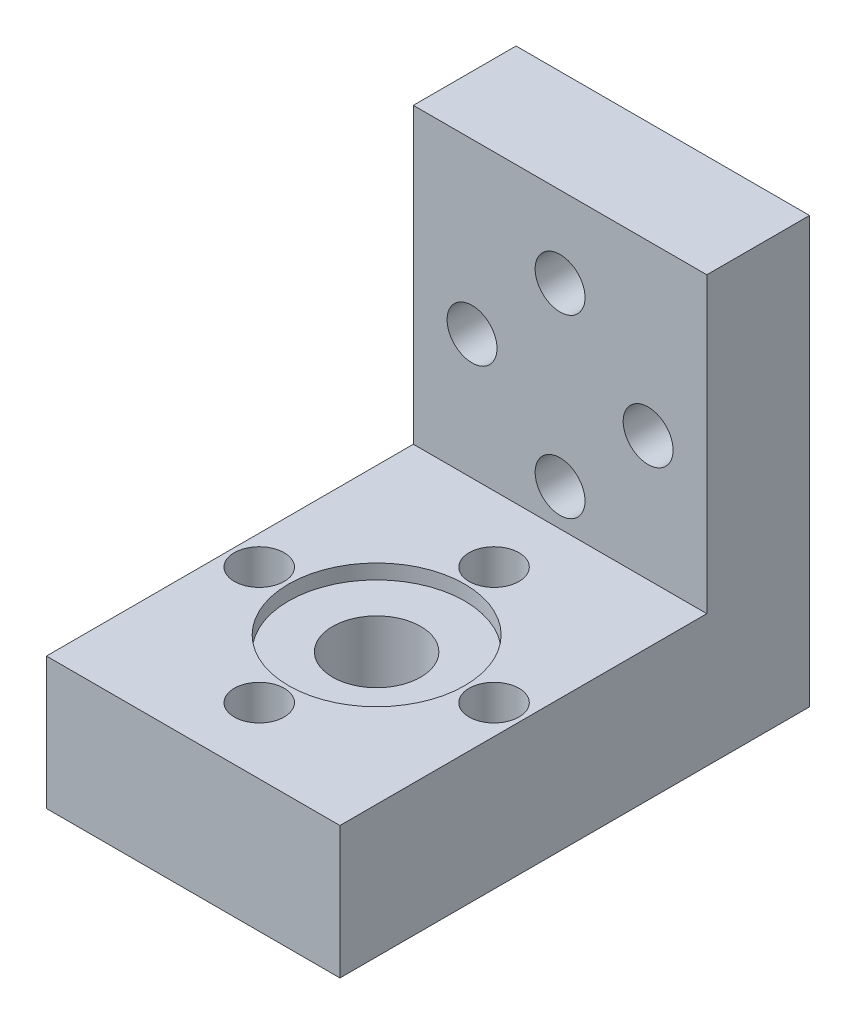
ISO-10303-21;
HEADER;
FILE_DESCRIPTION(('STEP AP214'),'2;1');
FILE_NAME('part.step','',(''),(''),'','','');
FILE_SCHEMA(('AUTOMOTIVE_DESIGN { 1 0 10303 214 1 1 1 1 }'));
ENDSEC;
DATA;
#1=APPLICATION_CONTEXT('core data for automotive mechanical design processes');
#2=APPLICATION_PROTOCOL_DEFINITION('international standard','automotive_design',2000,#1);
#3=PRODUCT_CONTEXT('',#1,'mechanical');
#4=PRODUCT('Part','Part','',(#3));
#5=PRODUCT_RELATED_PRODUCT_CATEGORY('part','',(#4));
#6=PRODUCT_DEFINITION_FORMATION('','',#4);
#7=PRODUCT_DEFINITION_CONTEXT('part definition',#1,'design');
#8=PRODUCT_DEFINITION('design','',#6,#7);
#9=PRODUCT_DEFINITION_SHAPE('','',#8);
#10=(LENGTH_UNIT() NAMED_UNIT(*) SI_UNIT(.MILLI.,.METRE.));
#11=(NAMED_UNIT(*) PLANE_ANGLE_UNIT() SI_UNIT($,.RADIAN.));
#12=(NAMED_UNIT(*) SI_UNIT($,.STERADIAN.) SOLID_ANGLE_UNIT());
#13=UNCERTAINTY_MEASURE_WITH_UNIT(LENGTH_MEASURE(1.E-05),#10,'distance_accuracy_value','');
#14=(GEOMETRIC_REPRESENTATION_CONTEXT(3) GLOBAL_UNCERTAINTY_ASSIGNED_CONTEXT((#13)) GLOBAL_UNIT_ASSIGNED_CONTEXT((#10,
#11,#12)) REPRESENTATION_CONTEXT('',''));
#15=CARTESIAN_POINT('',(0.,0.,0.));
#16=DIRECTION('',(0.,0.,1.));
#17=DIRECTION('',(1.,0.,0.));
#18=AXIS2_PLACEMENT_3D('',#15,#16,#17);
#19=CARTESIAN_POINT('',(40.,58.,-14.));
#20=DIRECTION('',(0.,0.,1.));
#21=DIRECTION('',(1.,0.,0.));
#22=AXIS2_PLACEMENT_3D('',#19,#20,#21);
#23=PLANE('',#22);
#24=CARTESIAN_POINT('',(20.,47.,-14.));
#25=DIRECTION('',(0.,0.,1.));
#26=DIRECTION('',(1.,0.,0.));
#27=AXIS2_PLACEMENT_3D('',#24,#25,#26);
#28=CIRCLE('',#27,3.4);
#29=CARTESIAN_POINT('',(23.4,47.,-14.));
#30=VERTEX_POINT('',#29);
#31=EDGE_CURVE('E197',#30,#30,#28,.T.);
#32=ORIENTED_EDGE('',*,*,#31,.T.);
#33=EDGE_LOOP('',(#32));
#34=FACE_BOUND('',#33,.T.);
#35=CARTESIAN_POINT('',(32.,35.,-14.));
#36=DIRECTION('',(0.,0.,1.));
#37=DIRECTION('',(1.,0.,0.));
#38=AXIS2_PLACEMENT_3D('',#35,#36,#37);
#39=CIRCLE('',#38,3.4);
#40=CARTESIAN_POINT('',(35.4,35.,-14.));
#41=VERTEX_POINT('',#40);
#42=EDGE_CURVE('E240',#41,#41,#39,.T.);
#43=ORIENTED_EDGE('',*,*,#42,.T.);
#44=EDGE_LOOP('',(#43));
#45=FACE_BOUND('',#44,.T.);
#46=CARTESIAN_POINT('',(20.,23.,-14.));
#47=DIRECTION('',(0.,0.,1.));
#48=DIRECTION('',(1.,0.,0.));
#49=AXIS2_PLACEMENT_3D('',#46,#47,#48);
#50=CIRCLE('',#49,3.4);
#51=CARTESIAN_POINT('',(23.4,23.,-14.));
#52=VERTEX_POINT('',#51);
#53=EDGE_CURVE('E232',#52,#52,#50,.T.);
#54=ORIENTED_EDGE('',*,*,#53,.T.);
#55=EDGE_LOOP('',(#54));
#56=FACE_BOUND('',#55,.T.);
#57=CARTESIAN_POINT('',(8.,35.,-14.));
#58=DIRECTION('',(0.,0.,1.));
#59=DIRECTION('',(1.,0.,0.));
#60=AXIS2_PLACEMENT_3D('',#57,#58,#59);
#61=CIRCLE('',#60,3.4);
#62=CARTESIAN_POINT('',(11.4,35.,-14.));
#63=VERTEX_POINT('',#62);
#64=EDGE_CURVE('E224',#63,#63,#61,.T.);
#65=ORIENTED_EDGE('',*,*,#64,.T.);
#66=EDGE_LOOP('',(#65));
#67=FACE_BOUND('',#66,.T.);
#68=DIRECTION('',(0.,1.,0.));
#69=VECTOR('',#68,1.);
#70=CARTESIAN_POINT('',(0.,58.,-14.));
#71=LINE('',#70,#69);
#72=CARTESIAN_POINT('',(0.,0.,-14.));
#73=VERTEX_POINT('',#72);
#74=CARTESIAN_POINT('',(0.,58.,-14.));
#75=VERTEX_POINT('',#74);
#76=EDGE_CURVE('E138',#73,#75,#71,.T.);
#77=ORIENTED_EDGE('',*,*,#76,.T.);
#78=DIRECTION('',(-1.,0.,0.));
#79=VECTOR('',#78,1.);
#80=CARTESIAN_POINT('',(40.,58.,-14.));
#81=LINE('',#80,#79);
#82=CARTESIAN_POINT('',(40.,58.,-14.));
#83=VERTEX_POINT('',#82);
#84=EDGE_CURVE('E54',#83,#75,#81,.T.);
#85=ORIENTED_EDGE('',*,*,#84,.F.);
#86=DIRECTION('',(0.,1.,0.));
#87=VECTOR('',#86,1.);
#88=CARTESIAN_POINT('',(40.,58.,-14.));
#89=LINE('',#88,#87);
#90=CARTESIAN_POINT('',(40.,0.,-14.));
#91=VERTEX_POINT('',#90);
#92=EDGE_CURVE('E100',#91,#83,#89,.T.);
#93=ORIENTED_EDGE('',*,*,#92,.F.);
#94=DIRECTION('',(-1.,0.,0.));
#95=VECTOR('',#94,1.);
#96=CARTESIAN_POINT('',(40.,0.,-14.));
#97=LINE('',#96,#95);
#98=EDGE_CURVE('E11',#91,#73,#97,.T.);
#99=ORIENTED_EDGE('',*,*,#98,.T.);
#100=EDGE_LOOP('',(#77,#85,#93,#99));
#101=FACE_BOUND('',#100,.T.);
#102=ADVANCED_FACE('F45',(#34,#45,#56,#67,#101),#23,.F.);
#103=CARTESIAN_POINT('',(40.,58.,0.));
#104=DIRECTION('',(0.,-1.,0.));
#105=DIRECTION('',(0.,0.,-1.));
#106=AXIS2_PLACEMENT_3D('',#103,#104,#105);
#107=PLANE('',#106);
#108=DIRECTION('',(0.,0.,1.));
#109=VECTOR('',#108,1.);
#110=CARTESIAN_POINT('',(0.,58.,0.));
#111=LINE('',#110,#109);
#112=CARTESIAN_POINT('',(0.,58.,0.));
#113=VERTEX_POINT('',#112);
#114=EDGE_CURVE('E141',#75,#113,#111,.T.);
#115=ORIENTED_EDGE('',*,*,#114,.T.);
#116=DIRECTION('',(-1.,0.,0.));
#117=VECTOR('',#116,1.);
#118=CARTESIAN_POINT('',(40.,58.,0.));
#119=LINE('',#118,#117);
#120=CARTESIAN_POINT('',(40.,58.,0.));
#121=VERTEX_POINT('',#120);
#122=EDGE_CURVE('E125',#121,#113,#119,.T.);
#123=ORIENTED_EDGE('',*,*,#122,.F.);
#124=DIRECTION('',(0.,0.,1.));
#125=VECTOR('',#124,1.);
#126=CARTESIAN_POINT('',(40.,58.,0.));
#127=LINE('',#126,#125);
#128=EDGE_CURVE('E114',#83,#121,#127,.T.);
#129=ORIENTED_EDGE('',*,*,#128,.F.);
#130=ORIENTED_EDGE('',*,*,#84,.T.);
#131=EDGE_LOOP('',(#115,#123,#129,#130));
#132=FACE_BOUND('',#131,.T.);
#133=ADVANCED_FACE('F163',(#132),#107,.F.);
#134=CARTESIAN_POINT('',(40.,18.,0.));
#135=DIRECTION('',(0.,0.,-1.));
#136=DIRECTION('',(0.,1.,0.));
#137=AXIS2_PLACEMENT_3D('',#134,#135,#136);
#138=PLANE('',#137);
#139=CARTESIAN_POINT('',(20.,47.,0.));
#140=DIRECTION('',(0.,0.,1.));
#141=DIRECTION('',(1.,0.,0.));
#142=AXIS2_PLACEMENT_3D('',#139,#140,#141);
#143=CIRCLE('',#142,3.4);
#144=CARTESIAN_POINT('',(23.4,47.,0.));
#145=VERTEX_POINT('',#144);
#146=EDGE_CURVE('E248',#145,#145,#143,.T.);
#147=ORIENTED_EDGE('',*,*,#146,.F.);
#148=EDGE_LOOP('',(#147));
#149=FACE_BOUND('',#148,.T.);
#150=CARTESIAN_POINT('',(32.,35.,0.));
#151=DIRECTION('',(0.,0.,1.));
#152=DIRECTION('',(1.,0.,0.));
#153=AXIS2_PLACEMENT_3D('',#150,#151,#152);
#154=CIRCLE('',#153,3.4);
#155=CARTESIAN_POINT('',(35.4,35.,0.));
#156=VERTEX_POINT('',#155);
#157=EDGE_CURVE('E244',#156,#156,#154,.T.);
#158=ORIENTED_EDGE('',*,*,#157,.F.);
#159=EDGE_LOOP('',(#158));
#160=FACE_BOUND('',#159,.T.);
#161=CARTESIAN_POINT('',(20.,23.,0.));
#162=DIRECTION('',(0.,0.,1.));
#163=DIRECTION('',(1.,0.,0.));
#164=AXIS2_PLACEMENT_3D('',#161,#162,#163);
#165=CIRCLE('',#164,3.4);
#166=CARTESIAN_POINT('',(23.4,23.,0.));
#167=VERTEX_POINT('',#166);
#168=EDGE_CURVE('E236',#167,#167,#165,.T.);
#169=ORIENTED_EDGE('',*,*,#168,.F.);
#170=EDGE_LOOP('',(#169));
#171=FACE_BOUND('',#170,.T.);
#172=CARTESIAN_POINT('',(8.,35.,0.));
#173=DIRECTION('',(0.,0.,1.));
#174=DIRECTION('',(1.,0.,0.));
#175=AXIS2_PLACEMENT_3D('',#172,#173,#174);
#176=CIRCLE('',#175,3.4);
#177=CARTESIAN_POINT('',(11.4,35.,0.));
#178=VERTEX_POINT('',#177);
#179=EDGE_CURVE('E228',#178,#178,#176,.T.);
#180=ORIENTED_EDGE('',*,*,#179,.F.);
#181=EDGE_LOOP('',(#180));
#182=FACE_BOUND('',#181,.T.);
#183=DIRECTION('',(0.,-1.,0.));
#184=VECTOR('',#183,1.);
#185=CARTESIAN_POINT('',(0.,18.,0.));
#186=LINE('',#185,#184);
#187=CARTESIAN_POINT('',(0.,18.,0.));
#188=VERTEX_POINT('',#187);
#189=EDGE_CURVE('E123',#113,#188,#186,.T.);
#190=ORIENTED_EDGE('',*,*,#189,.T.);
#191=DIRECTION('',(-1.,0.,0.));
#192=VECTOR('',#191,1.);
#193=CARTESIAN_POINT('',(40.,18.,0.));
#194=LINE('',#193,#192);
#195=CARTESIAN_POINT('',(40.,18.,0.));
#196=VERTEX_POINT('',#195);
#197=EDGE_CURVE('E120',#196,#188,#194,.T.);
#198=ORIENTED_EDGE('',*,*,#197,.F.);
#199=DIRECTION('',(0.,-1.,0.));
#200=VECTOR('',#199,1.);
#201=CARTESIAN_POINT('',(40.,18.,0.));
#202=LINE('',#201,#200);
#203=EDGE_CURVE('E108',#121,#196,#202,.T.);
#204=ORIENTED_EDGE('',*,*,#203,.F.);
#205=ORIENTED_EDGE('',*,*,#122,.T.);
#206=EDGE_LOOP('',(#190,#198,#204,#205));
#207=FACE_BOUND('',#206,.T.);
#208=ADVANCED_FACE('F121',(#149,#160,#171,#182,#207),#138,.F.);
#209=CARTESIAN_POINT('',(40.,18.,50.));
#210=DIRECTION('',(0.,-1.,0.));
#211=DIRECTION('',(0.,0.,-1.));
#212=AXIS2_PLACEMENT_3D('',#209,#210,#211);
#213=PLANE('',#212);
#214=CARTESIAN_POINT('',(20.,18.,9.));
#215=DIRECTION('',(0.,1.,0.));
#216=DIRECTION('',(0.,0.,1.));
#217=AXIS2_PLACEMENT_3D('',#214,#215,#216);
#218=CIRCLE('',#217,3.40000000000035);
#219=CARTESIAN_POINT('',(20.,18.,12.4000000000004));
#220=VERTEX_POINT('',#219);
#221=EDGE_CURVE('E217',#220,#220,#218,.T.);
#222=ORIENTED_EDGE('',*,*,#221,.F.);
#223=EDGE_LOOP('',(#222));
#224=FACE_BOUND('',#223,.T.);
#225=CARTESIAN_POINT('',(36.0000000000002,18.,24.9999999999998));
#226=DIRECTION('',(0.,1.,0.));
#227=DIRECTION('',(0.,0.,1.));
#228=AXIS2_PLACEMENT_3D('',#225,#226,#227);
#229=CIRCLE('',#228,3.40000000000035);
#230=CARTESIAN_POINT('',(36.0000000000002,18.,28.4000000000002));
#231=VERTEX_POINT('',#230);
#232=EDGE_CURVE('E213',#231,#231,#229,.T.);
#233=ORIENTED_EDGE('',*,*,#232,.F.);
#234=EDGE_LOOP('',(#233));
#235=FACE_BOUND('',#234,.T.);
#236=CARTESIAN_POINT('',(20.0000000000003,18.,41.));
#237=DIRECTION('',(0.,1.,0.));
#238=DIRECTION('',(0.,0.,1.));
#239=AXIS2_PLACEMENT_3D('',#236,#237,#238);
#240=CIRCLE('',#239,3.40000000000035);
#241=CARTESIAN_POINT('',(20.0000000000003,18.,44.4000000000003));
#242=VERTEX_POINT('',#241);
#243=EDGE_CURVE('E205',#242,#242,#240,.T.);
#244=ORIENTED_EDGE('',*,*,#243,.F.);
#245=EDGE_LOOP('',(#244));
#246=FACE_BOUND('',#245,.T.);
#247=CARTESIAN_POINT('',(4.00000000000022,18.,25.0000000000001));
#248=DIRECTION('',(0.,1.,0.));
#249=DIRECTION('',(0.,0.,1.));
#250=AXIS2_PLACEMENT_3D('',#247,#248,#249);
#251=CIRCLE('',#250,3.40000000000035);
#252=CARTESIAN_POINT('',(4.00000000000022,18.,28.4000000000004));
#253=VERTEX_POINT('',#252);
#254=EDGE_CURVE('E196',#253,#253,#251,.T.);
#255=ORIENTED_EDGE('',*,*,#254,.F.);
#256=EDGE_LOOP('',(#255));
#257=FACE_BOUND('',#256,.T.);
#258=CARTESIAN_POINT('',(20.,18.,25.));
#259=DIRECTION('',(0.,1.,0.));
#260=DIRECTION('',(0.,0.,1.));
#261=AXIS2_PLACEMENT_3D('',#258,#259,#260);
#262=CIRCLE('',#261,12.);
#263=CARTESIAN_POINT('',(20.,18.,37.));
#264=VERTEX_POINT('',#263);
#265=EDGE_CURVE('E175',#264,#264,#262,.T.);
#266=ORIENTED_EDGE('',*,*,#265,.F.);
#267=EDGE_LOOP('',(#266));
#268=FACE_BOUND('',#267,.T.);
#269=DIRECTION('',(0.,0.,1.));
#270=VECTOR('',#269,1.);
#271=CARTESIAN_POINT('',(0.,18.,50.));
#272=LINE('',#271,#270);
#273=CARTESIAN_POINT('',(0.,18.,50.));
#274=VERTEX_POINT('',#273);
#275=EDGE_CURVE('E86',#188,#274,#272,.T.);
#276=ORIENTED_EDGE('',*,*,#275,.T.);
#277=DIRECTION('',(-1.,0.,0.));
#278=VECTOR('',#277,1.);
#279=CARTESIAN_POINT('',(40.,18.,50.));
#280=LINE('',#279,#278);
#281=CARTESIAN_POINT('',(40.,18.,50.));
#282=VERTEX_POINT('',#281);
#283=EDGE_CURVE('E126',#282,#274,#280,.T.);
#284=ORIENTED_EDGE('',*,*,#283,.F.);
#285=DIRECTION('',(0.,0.,1.));
#286=VECTOR('',#285,1.);
#287=CARTESIAN_POINT('',(40.,18.,50.));
#288=LINE('',#287,#286);
#289=EDGE_CURVE('E112',#196,#282,#288,.T.);
#290=ORIENTED_EDGE('',*,*,#289,.F.);
#291=ORIENTED_EDGE('',*,*,#197,.T.);
#292=EDGE_LOOP('',(#276,#284,#290,#291));
#293=FACE_BOUND('',#292,.T.);
#294=ADVANCED_FACE('F128',(#224,#235,#246,#257,#268,#293),#213,.F.);
#295=CARTESIAN_POINT('',(40.,0.,50.));
#296=DIRECTION('',(0.,0.,-1.));
#297=DIRECTION('',(-1.,0.,0.));
#298=AXIS2_PLACEMENT_3D('',#295,#296,#297);
#299=PLANE('',#298);
#300=DIRECTION('',(0.,-1.,0.));
#301=VECTOR('',#300,1.);
#302=CARTESIAN_POINT('',(0.,0.,50.));
#303=LINE('',#302,#301);
#304=CARTESIAN_POINT('',(0.,0.,50.));
#305=VERTEX_POINT('',#304);
#306=EDGE_CURVE('E93',#274,#305,#303,.T.);
#307=ORIENTED_EDGE('',*,*,#306,.T.);
#308=DIRECTION('',(-1.,0.,0.));
#309=VECTOR('',#308,1.);
#310=CARTESIAN_POINT('',(40.,0.,50.));
#311=LINE('',#310,#309);
#312=CARTESIAN_POINT('',(40.,0.,50.));
#313=VERTEX_POINT('',#312);
#314=EDGE_CURVE('E134',#313,#305,#311,.T.);
#315=ORIENTED_EDGE('',*,*,#314,.F.);
#316=DIRECTION('',(0.,-1.,0.));
#317=VECTOR('',#316,1.);
#318=CARTESIAN_POINT('',(40.,0.,50.));
#319=LINE('',#318,#317);
#320=EDGE_CURVE('E131',#282,#313,#319,.T.);
#321=ORIENTED_EDGE('',*,*,#320,.F.);
#322=ORIENTED_EDGE('',*,*,#283,.T.);
#323=EDGE_LOOP('',(#307,#315,#321,#322));
#324=FACE_BOUND('',#323,.T.);
#325=ADVANCED_FACE('F169',(#324),#299,.F.);
#326=CARTESIAN_POINT('',(40.,0.,0.));
#327=DIRECTION('',(0.,1.,0.));
#328=DIRECTION('',(0.,0.,1.));
#329=AXIS2_PLACEMENT_3D('',#326,#327,#328);
#330=PLANE('',#329);
#331=CARTESIAN_POINT('',(20.,0.,9.));
#332=DIRECTION('',(0.,1.,0.));
#333=DIRECTION('',(0.,0.,1.));
#334=AXIS2_PLACEMENT_3D('',#331,#332,#333);
#335=CIRCLE('',#334,3.40000000000035);
#336=CARTESIAN_POINT('',(20.,0.,12.4000000000004));
#337=VERTEX_POINT('',#336);
#338=EDGE_CURVE('E188',#337,#337,#335,.T.);
#339=ORIENTED_EDGE('',*,*,#338,.T.);
#340=EDGE_LOOP('',(#339));
#341=FACE_BOUND('',#340,.T.);
#342=CARTESIAN_POINT('',(36.0000000000002,0.,24.9999999999998));
#343=DIRECTION('',(0.,1.,0.));
#344=DIRECTION('',(0.,0.,1.));
#345=AXIS2_PLACEMENT_3D('',#342,#343,#344);
#346=CIRCLE('',#345,3.40000000000035);
#347=CARTESIAN_POINT('',(36.0000000000002,0.,28.4000000000002));
#348=VERTEX_POINT('',#347);
#349=EDGE_CURVE('E209',#348,#348,#346,.T.);
#350=ORIENTED_EDGE('',*,*,#349,.T.);
#351=EDGE_LOOP('',(#350));
#352=FACE_BOUND('',#351,.T.);
#353=CARTESIAN_POINT('',(20.0000000000003,0.,41.));
#354=DIRECTION('',(0.,1.,0.));
#355=DIRECTION('',(0.,0.,1.));
#356=AXIS2_PLACEMENT_3D('',#353,#354,#355);
#357=CIRCLE('',#356,3.40000000000035);
#358=CARTESIAN_POINT('',(20.0000000000003,0.,44.4000000000003));
#359=VERTEX_POINT('',#358);
#360=EDGE_CURVE('E201',#359,#359,#357,.T.);
#361=ORIENTED_EDGE('',*,*,#360,.T.);
#362=EDGE_LOOP('',(#361));
#363=FACE_BOUND('',#362,.T.);
#364=CARTESIAN_POINT('',(4.00000000000022,0.,25.0000000000001));
#365=DIRECTION('',(0.,1.,0.));
#366=DIRECTION('',(0.,0.,1.));
#367=AXIS2_PLACEMENT_3D('',#364,#365,#366);
#368=CIRCLE('',#367,3.40000000000035);
#369=CARTESIAN_POINT('',(4.00000000000022,0.,28.4000000000004));
#370=VERTEX_POINT('',#369);
#371=EDGE_CURVE('E192',#370,#370,#368,.T.);
#372=ORIENTED_EDGE('',*,*,#371,.T.);
#373=EDGE_LOOP('',(#372));
#374=FACE_BOUND('',#373,.T.);
#375=CARTESIAN_POINT('',(20.,0.,25.));
#376=DIRECTION('',(0.,1.,0.));
#377=DIRECTION('',(0.,0.,1.));
#378=AXIS2_PLACEMENT_3D('',#375,#376,#377);
#379=CIRCLE('',#378,6.);
#380=CARTESIAN_POINT('',(20.,0.,31.));
#381=VERTEX_POINT('',#380);
#382=EDGE_CURVE('E180',#381,#381,#379,.T.);
#383=ORIENTED_EDGE('',*,*,#382,.T.);
#384=EDGE_LOOP('',(#383));
#385=FACE_BOUND('',#384,.T.);
#386=DIRECTION('',(0.,0.,-1.));
#387=VECTOR('',#386,1.);
#388=CARTESIAN_POINT('',(0.,0.,0.));
#389=LINE('',#388,#387);
#390=EDGE_CURVE('E151',#305,#73,#389,.T.);
#391=ORIENTED_EDGE('',*,*,#390,.T.);
#392=ORIENTED_EDGE('',*,*,#98,.F.);
#393=DIRECTION('',(0.,0.,-1.));
#394=VECTOR('',#393,1.);
#395=CARTESIAN_POINT('',(40.,0.,-14.));
#396=LINE('',#395,#394);
#397=EDGE_CURVE('E62',#313,#91,#396,.T.);
#398=ORIENTED_EDGE('',*,*,#397,.F.);
#399=ORIENTED_EDGE('',*,*,#314,.T.);
#400=EDGE_LOOP('',(#391,#392,#398,#399));
#401=FACE_BOUND('',#400,.T.);
#402=ADVANCED_FACE('F168',(#341,#352,#363,#374,#385,#401),#330,.F.);
#403=CARTESIAN_POINT('',(40.,0.,0.));
#404=DIRECTION('',(-1.,0.,0.));
#405=DIRECTION('',(0.,0.,1.));
#406=AXIS2_PLACEMENT_3D('',#403,#404,#405);
#407=PLANE('',#406);
#408=ORIENTED_EDGE('',*,*,#397,.T.);
#409=ORIENTED_EDGE('',*,*,#92,.T.);
#410=ORIENTED_EDGE('',*,*,#128,.T.);
#411=ORIENTED_EDGE('',*,*,#203,.T.);
#412=ORIENTED_EDGE('',*,*,#289,.T.);
#413=ORIENTED_EDGE('',*,*,#320,.T.);
#414=EDGE_LOOP('',(#408,#409,#410,#411,#412,#413));
#415=FACE_BOUND('',#414,.T.);
#416=ADVANCED_FACE('F110',(#415),#407,.F.);
#417=CARTESIAN_POINT('',(0.,0.,0.));
#418=DIRECTION('',(-1.,0.,0.));
#419=DIRECTION('',(0.,0.,1.));
#420=AXIS2_PLACEMENT_3D('',#417,#418,#419);
#421=PLANE('',#420);
#422=ORIENTED_EDGE('',*,*,#76,.F.);
#423=ORIENTED_EDGE('',*,*,#390,.F.);
#424=ORIENTED_EDGE('',*,*,#306,.F.);
#425=ORIENTED_EDGE('',*,*,#275,.F.);
#426=ORIENTED_EDGE('',*,*,#189,.F.);
#427=ORIENTED_EDGE('',*,*,#114,.F.);
#428=EDGE_LOOP('',(#422,#423,#424,#425,#426,#427));
#429=FACE_BOUND('',#428,.T.);
#430=ADVANCED_FACE('F166',(#429),#421,.T.);
#431=CARTESIAN_POINT('',(20.,16.,25.));
#432=DIRECTION('',(0.,1.,0.));
#433=DIRECTION('',(0.,0.,1.));
#434=AXIS2_PLACEMENT_3D('',#431,#432,#433);
#435=CYLINDRICAL_SURFACE('',#434,12.);
#436=CARTESIAN_POINT('',(20.,16.,25.));
#437=DIRECTION('',(0.,1.,0.));
#438=DIRECTION('',(0.,0.,1.));
#439=AXIS2_PLACEMENT_3D('',#436,#437,#438);
#440=CIRCLE('',#439,12.);
#441=CARTESIAN_POINT('',(20.,16.,37.));
#442=VERTEX_POINT('',#441);
#443=EDGE_CURVE('E142',#442,#442,#440,.T.);
#444=ORIENTED_EDGE('',*,*,#443,.F.);
#445=EDGE_LOOP('',(#444));
#446=FACE_BOUND('',#445,.T.);
#447=ORIENTED_EDGE('',*,*,#265,.T.);
#448=EDGE_LOOP('',(#447));
#449=FACE_BOUND('',#448,.T.);
#450=ADVANCED_FACE('F307',(#446,#449),#435,.F.);
#451=CARTESIAN_POINT('',(20.,16.,25.));
#452=DIRECTION('',(0.,1.,0.));
#453=DIRECTION('',(0.,0.,1.));
#454=AXIS2_PLACEMENT_3D('',#451,#452,#453);
#455=PLANE('',#454);
#456=CARTESIAN_POINT('',(20.,16.,25.));
#457=DIRECTION('',(0.,1.,0.));
#458=DIRECTION('',(0.,0.,1.));
#459=AXIS2_PLACEMENT_3D('',#456,#457,#458);
#460=CIRCLE('',#459,6.);
#461=CARTESIAN_POINT('',(20.,16.,31.));
#462=VERTEX_POINT('',#461);
#463=EDGE_CURVE('E184',#462,#462,#460,.T.);
#464=ORIENTED_EDGE('',*,*,#463,.F.);
#465=EDGE_LOOP('',(#464));
#466=FACE_BOUND('',#465,.T.);
#467=ORIENTED_EDGE('',*,*,#443,.T.);
#468=EDGE_LOOP('',(#467));
#469=FACE_BOUND('',#468,.T.);
#470=ADVANCED_FACE('F312',(#466,#469),#455,.T.);
#471=CARTESIAN_POINT('',(20.,0.,25.));
#472=DIRECTION('',(0.,1.,0.));
#473=DIRECTION('',(0.,0.,1.));
#474=AXIS2_PLACEMENT_3D('',#471,#472,#473);
#475=CYLINDRICAL_SURFACE('',#474,6.);
#476=ORIENTED_EDGE('',*,*,#382,.F.);
#477=EDGE_LOOP('',(#476));
#478=FACE_BOUND('',#477,.T.);
#479=ORIENTED_EDGE('',*,*,#463,.T.);
#480=EDGE_LOOP('',(#479));
#481=FACE_BOUND('',#480,.T.);
#482=ADVANCED_FACE('F316',(#478,#481),#475,.F.);
#483=CARTESIAN_POINT('',(4.00000000000022,0.,25.0000000000001));
#484=DIRECTION('',(0.,1.,0.));
#485=DIRECTION('',(0.,0.,1.));
#486=AXIS2_PLACEMENT_3D('',#483,#484,#485);
#487=CYLINDRICAL_SURFACE('',#486,3.40000000000035);
#488=ORIENTED_EDGE('',*,*,#371,.F.);
#489=EDGE_LOOP('',(#488));
#490=FACE_BOUND('',#489,.T.);
#491=ORIENTED_EDGE('',*,*,#254,.T.);
#492=EDGE_LOOP('',(#491));
#493=FACE_BOUND('',#492,.T.);
#494=ADVANCED_FACE('F320',(#490,#493),#487,.F.);
#495=CARTESIAN_POINT('',(20.0000000000003,0.,41.));
#496=DIRECTION('',(0.,1.,0.));
#497=DIRECTION('',(0.,0.,1.));
#498=AXIS2_PLACEMENT_3D('',#495,#496,#497);
#499=CYLINDRICAL_SURFACE('',#498,3.40000000000035);
#500=ORIENTED_EDGE('',*,*,#360,.F.);
#501=EDGE_LOOP('',(#500));
#502=FACE_BOUND('',#501,.T.);
#503=ORIENTED_EDGE('',*,*,#243,.T.);
#504=EDGE_LOOP('',(#503));
#505=FACE_BOUND('',#504,.T.);
#506=ADVANCED_FACE('F324',(#502,#505),#499,.F.);
#507=CARTESIAN_POINT('',(36.0000000000002,0.,24.9999999999998));
#508=DIRECTION('',(0.,1.,0.));
#509=DIRECTION('',(0.,0.,1.));
#510=AXIS2_PLACEMENT_3D('',#507,#508,#509);
#511=CYLINDRICAL_SURFACE('',#510,3.40000000000035);
#512=ORIENTED_EDGE('',*,*,#349,.F.);
#513=EDGE_LOOP('',(#512));
#514=FACE_BOUND('',#513,.T.);
#515=ORIENTED_EDGE('',*,*,#232,.T.);
#516=EDGE_LOOP('',(#515));
#517=FACE_BOUND('',#516,.T.);
#518=ADVANCED_FACE('F286',(#514,#517),#511,.F.);
#519=CARTESIAN_POINT('',(20.,0.,9.));
#520=DIRECTION('',(0.,1.,0.));
#521=DIRECTION('',(0.,0.,1.));
#522=AXIS2_PLACEMENT_3D('',#519,#520,#521);
#523=CYLINDRICAL_SURFACE('',#522,3.40000000000035);
#524=ORIENTED_EDGE('',*,*,#338,.F.);
#525=EDGE_LOOP('',(#524));
#526=FACE_BOUND('',#525,.T.);
#527=ORIENTED_EDGE('',*,*,#221,.T.);
#528=EDGE_LOOP('',(#527));
#529=FACE_BOUND('',#528,.T.);
#530=ADVANCED_FACE('F277',(#526,#529),#523,.F.);
#531=CARTESIAN_POINT('',(8.,35.,-14.));
#532=DIRECTION('',(0.,0.,1.));
#533=DIRECTION('',(1.,0.,0.));
#534=AXIS2_PLACEMENT_3D('',#531,#532,#533);
#535=CYLINDRICAL_SURFACE('',#534,3.4);
#536=ORIENTED_EDGE('',*,*,#64,.F.);
#537=EDGE_LOOP('',(#536));
#538=FACE_BOUND('',#537,.T.);
#539=ORIENTED_EDGE('',*,*,#179,.T.);
#540=EDGE_LOOP('',(#539));
#541=FACE_BOUND('',#540,.T.);
#542=ADVANCED_FACE('F274',(#538,#541),#535,.F.);
#543=CARTESIAN_POINT('',(20.,23.,-14.));
#544=DIRECTION('',(0.,0.,1.));
#545=DIRECTION('',(1.,0.,0.));
#546=AXIS2_PLACEMENT_3D('',#543,#544,#545);
#547=CYLINDRICAL_SURFACE('',#546,3.4);
#548=ORIENTED_EDGE('',*,*,#53,.F.);
#549=EDGE_LOOP('',(#548));
#550=FACE_BOUND('',#549,.T.);
#551=ORIENTED_EDGE('',*,*,#168,.T.);
#552=EDGE_LOOP('',(#551));
#553=FACE_BOUND('',#552,.T.);
#554=ADVANCED_FACE('F276',(#550,#553),#547,.F.);
#555=CARTESIAN_POINT('',(32.,35.,-14.));
#556=DIRECTION('',(0.,0.,1.));
#557=DIRECTION('',(1.,0.,0.));
#558=AXIS2_PLACEMENT_3D('',#555,#556,#557);
#559=CYLINDRICAL_SURFACE('',#558,3.4);
#560=ORIENTED_EDGE('',*,*,#42,.F.);
#561=EDGE_LOOP('',(#560));
#562=FACE_BOUND('',#561,.T.);
#563=ORIENTED_EDGE('',*,*,#157,.T.);
#564=EDGE_LOOP('',(#563));
#565=FACE_BOUND('',#564,.T.);
#566=ADVANCED_FACE('F261',(#562,#565),#559,.F.);
#567=CARTESIAN_POINT('',(20.,47.,-14.));
#568=DIRECTION('',(0.,0.,1.));
#569=DIRECTION('',(1.,0.,0.));
#570=AXIS2_PLACEMENT_3D('',#567,#568,#569);
#571=CYLINDRICAL_SURFACE('',#570,3.4);
#572=ORIENTED_EDGE('',*,*,#31,.F.);
#573=EDGE_LOOP('',(#572));
#574=FACE_BOUND('',#573,.T.);
#575=ORIENTED_EDGE('',*,*,#146,.T.);
#576=EDGE_LOOP('',(#575));
#577=FACE_BOUND('',#576,.T.);
#578=ADVANCED_FACE('F258',(#574,#577),#571,.F.);
#579=CLOSED_SHELL('',(#102,#133,#208,#294,#325,#402,#416,#430,#450,#470,#482,#494,#506,#518,
#530,#542,#554,#566,#578));
#580=MANIFOLD_SOLID_BREP('B2',#579);
#581=ADVANCED_BREP_SHAPE_REPRESENTATION('',(#18,#580),#14);
#582=SHAPE_DEFINITION_REPRESENTATION(#9,#581);
ENDSEC;
END-ISO-10303-21;
